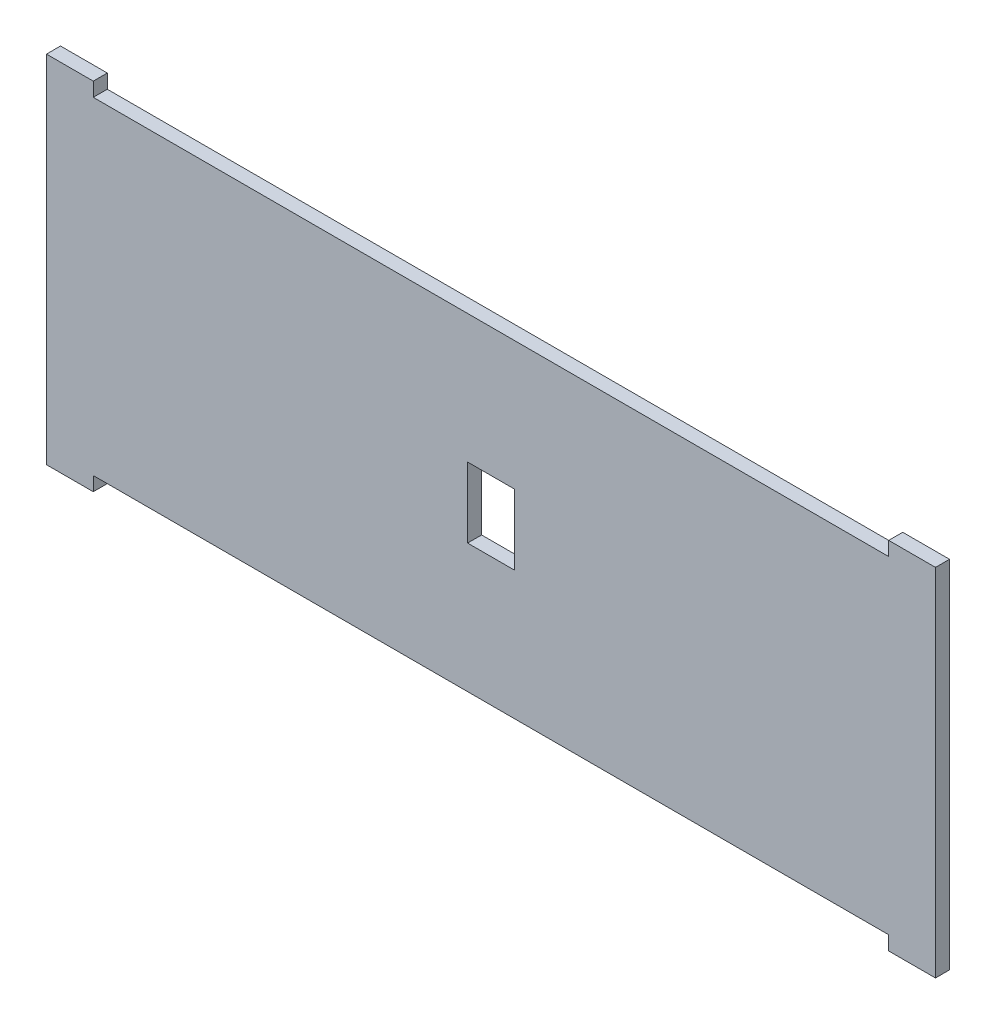
ISO-10303-21;
HEADER;
FILE_DESCRIPTION(('STEP AP214'),'2;1');
FILE_NAME('part.step','',(''),(''),'','','');
FILE_SCHEMA(('AUTOMOTIVE_DESIGN { 1 0 10303 214 1 1 1 1 }'));
ENDSEC;
DATA;
#1=APPLICATION_CONTEXT('core data for automotive mechanical design processes');
#2=APPLICATION_PROTOCOL_DEFINITION('international standard','automotive_design',2000,#1);
#3=PRODUCT_CONTEXT('',#1,'mechanical');
#4=PRODUCT('Part','Part','',(#3));
#5=PRODUCT_RELATED_PRODUCT_CATEGORY('part','',(#4));
#6=PRODUCT_DEFINITION_FORMATION('','',#4);
#7=PRODUCT_DEFINITION_CONTEXT('part definition',#1,'design');
#8=PRODUCT_DEFINITION('design','',#6,#7);
#9=PRODUCT_DEFINITION_SHAPE('','',#8);
#10=(LENGTH_UNIT() NAMED_UNIT(*) SI_UNIT(.MILLI.,.METRE.));
#11=(NAMED_UNIT(*) PLANE_ANGLE_UNIT() SI_UNIT($,.RADIAN.));
#12=(NAMED_UNIT(*) SI_UNIT($,.STERADIAN.) SOLID_ANGLE_UNIT());
#13=UNCERTAINTY_MEASURE_WITH_UNIT(LENGTH_MEASURE(1.E-05),#10,'distance_accuracy_value','');
#14=(GEOMETRIC_REPRESENTATION_CONTEXT(3) GLOBAL_UNCERTAINTY_ASSIGNED_CONTEXT((#13)) GLOBAL_UNIT_ASSIGNED_CONTEXT((#10,
#11,#12)) REPRESENTATION_CONTEXT('',''));
#15=CARTESIAN_POINT('',(0.,0.,0.));
#16=DIRECTION('',(0.,0.,1.));
#17=DIRECTION('',(1.,0.,0.));
#18=AXIS2_PLACEMENT_3D('',#15,#16,#17);
#19=CARTESIAN_POINT('',(-85.0000000000001,0.,3.));
#20=DIRECTION('',(1.,0.,0.));
#21=DIRECTION('',(0.,0.,-1.));
#22=AXIS2_PLACEMENT_3D('',#19,#20,#21);
#23=PLANE('',#22);
#24=DIRECTION('',(0.,-1.,0.));
#25=VECTOR('',#24,1.);
#26=CARTESIAN_POINT('',(-85.0000000000001,0.,0.));
#27=LINE('',#26,#25);
#28=CARTESIAN_POINT('',(-85.0000000000001,-35.,0.));
#29=VERTEX_POINT('',#28);
#30=CARTESIAN_POINT('',(-85.0000000000001,-38.,0.));
#31=VERTEX_POINT('',#30);
#32=EDGE_CURVE('E186',#29,#31,#27,.T.);
#33=ORIENTED_EDGE('',*,*,#32,.F.);
#34=DIRECTION('',(0.,0.,-1.));
#35=VECTOR('',#34,1.);
#36=CARTESIAN_POINT('',(-85.0000000000001,-35.,3.));
#37=LINE('',#36,#35);
#38=CARTESIAN_POINT('',(-85.0000000000001,-35.,3.));
#39=VERTEX_POINT('',#38);
#40=EDGE_CURVE('E312',#39,#29,#37,.T.);
#41=ORIENTED_EDGE('',*,*,#40,.F.);
#42=DIRECTION('',(0.,-1.,0.));
#43=VECTOR('',#42,1.);
#44=CARTESIAN_POINT('',(-85.0000000000001,0.,3.));
#45=LINE('',#44,#43);
#46=CARTESIAN_POINT('',(-85.0000000000001,-38.,3.));
#47=VERTEX_POINT('',#46);
#48=EDGE_CURVE('E191',#39,#47,#45,.T.);
#49=ORIENTED_EDGE('',*,*,#48,.T.);
#50=DIRECTION('',(0.,0.,-1.));
#51=VECTOR('',#50,1.);
#52=CARTESIAN_POINT('',(-85.0000000000001,-38.,3.));
#53=LINE('',#52,#51);
#54=EDGE_CURVE('E233',#47,#31,#53,.T.);
#55=ORIENTED_EDGE('',*,*,#54,.T.);
#56=EDGE_LOOP('',(#33,#41,#49,#55));
#57=FACE_BOUND('',#56,.T.);
#58=ADVANCED_FACE('F42',(#57),#23,.T.);
#59=CARTESIAN_POINT('',(0.,-35.,3.));
#60=DIRECTION('',(0.,-1.,0.));
#61=DIRECTION('',(1.,0.,0.));
#62=AXIS2_PLACEMENT_3D('',#59,#60,#61);
#63=PLANE('',#62);
#64=DIRECTION('',(-1.,0.,0.));
#65=VECTOR('',#64,1.);
#66=CARTESIAN_POINT('',(0.,-35.,0.));
#67=LINE('',#66,#65);
#68=CARTESIAN_POINT('',(85.,-35.,0.));
#69=VERTEX_POINT('',#68);
#70=EDGE_CURVE('E237',#69,#29,#67,.T.);
#71=ORIENTED_EDGE('',*,*,#70,.F.);
#72=DIRECTION('',(0.,0.,-1.));
#73=VECTOR('',#72,1.);
#74=CARTESIAN_POINT('',(85.,-35.,3.));
#75=LINE('',#74,#73);
#76=CARTESIAN_POINT('',(85.,-35.,3.));
#77=VERTEX_POINT('',#76);
#78=EDGE_CURVE('E309',#77,#69,#75,.T.);
#79=ORIENTED_EDGE('',*,*,#78,.F.);
#80=DIRECTION('',(-1.,0.,0.));
#81=VECTOR('',#80,1.);
#82=CARTESIAN_POINT('',(0.,-35.,3.));
#83=LINE('',#82,#81);
#84=EDGE_CURVE('E195',#77,#39,#83,.T.);
#85=ORIENTED_EDGE('',*,*,#84,.T.);
#86=ORIENTED_EDGE('',*,*,#40,.T.);
#87=EDGE_LOOP('',(#71,#79,#85,#86));
#88=FACE_BOUND('',#87,.T.);
#89=ADVANCED_FACE('F340',(#88),#63,.T.);
#90=CARTESIAN_POINT('',(85.,0.,3.));
#91=DIRECTION('',(1.,0.,0.));
#92=DIRECTION('',(0.,0.,-1.));
#93=AXIS2_PLACEMENT_3D('',#90,#91,#92);
#94=PLANE('',#93);
#95=DIRECTION('',(0.,-1.,0.));
#96=VECTOR('',#95,1.);
#97=CARTESIAN_POINT('',(85.,0.,0.));
#98=LINE('',#97,#96);
#99=CARTESIAN_POINT('',(85.,-38.,0.));
#100=VERTEX_POINT('',#99);
#101=EDGE_CURVE('E241',#69,#100,#98,.T.);
#102=ORIENTED_EDGE('',*,*,#101,.T.);
#103=DIRECTION('',(0.,0.,-1.));
#104=VECTOR('',#103,1.);
#105=CARTESIAN_POINT('',(85.,-38.,3.));
#106=LINE('',#105,#104);
#107=CARTESIAN_POINT('',(85.,-38.,3.));
#108=VERTEX_POINT('',#107);
#109=EDGE_CURVE('E306',#108,#100,#106,.T.);
#110=ORIENTED_EDGE('',*,*,#109,.F.);
#111=DIRECTION('',(0.,-1.,0.));
#112=VECTOR('',#111,1.);
#113=CARTESIAN_POINT('',(85.,0.,3.));
#114=LINE('',#113,#112);
#115=EDGE_CURVE('E200',#77,#108,#114,.T.);
#116=ORIENTED_EDGE('',*,*,#115,.F.);
#117=ORIENTED_EDGE('',*,*,#78,.T.);
#118=EDGE_LOOP('',(#102,#110,#116,#117));
#119=FACE_BOUND('',#118,.T.);
#120=ADVANCED_FACE('F345',(#119),#94,.F.);
#121=CARTESIAN_POINT('',(0.,-38.0000000000001,3.));
#122=DIRECTION('',(0.,-1.,0.));
#123=DIRECTION('',(1.,0.,0.));
#124=AXIS2_PLACEMENT_3D('',#121,#122,#123);
#125=PLANE('',#124);
#126=DIRECTION('',(-1.,0.,0.));
#127=VECTOR('',#126,1.);
#128=CARTESIAN_POINT('',(0.,-38.0000000000001,0.));
#129=LINE('',#128,#127);
#130=CARTESIAN_POINT('',(94.9999999999999,-38.,0.));
#131=VERTEX_POINT('',#130);
#132=EDGE_CURVE('E245',#131,#100,#129,.T.);
#133=ORIENTED_EDGE('',*,*,#132,.F.);
#134=DIRECTION('',(0.,0.,-1.));
#135=VECTOR('',#134,1.);
#136=CARTESIAN_POINT('',(94.9999999999999,-38.,3.));
#137=LINE('',#136,#135);
#138=CARTESIAN_POINT('',(94.9999999999999,-38.,3.));
#139=VERTEX_POINT('',#138);
#140=EDGE_CURVE('E303',#139,#131,#137,.T.);
#141=ORIENTED_EDGE('',*,*,#140,.F.);
#142=DIRECTION('',(-1.,0.,0.));
#143=VECTOR('',#142,1.);
#144=CARTESIAN_POINT('',(0.,-38.0000000000001,3.));
#145=LINE('',#144,#143);
#146=EDGE_CURVE('E203',#139,#108,#145,.T.);
#147=ORIENTED_EDGE('',*,*,#146,.T.);
#148=ORIENTED_EDGE('',*,*,#109,.T.);
#149=EDGE_LOOP('',(#133,#141,#147,#148));
#150=FACE_BOUND('',#149,.T.);
#151=ADVANCED_FACE('F391',(#150),#125,.T.);
#152=CARTESIAN_POINT('',(94.9999999999999,0.,3.));
#153=DIRECTION('',(-1.,0.,0.));
#154=DIRECTION('',(0.,0.,1.));
#155=AXIS2_PLACEMENT_3D('',#152,#153,#154);
#156=PLANE('',#155);
#157=DIRECTION('',(0.,1.,0.));
#158=VECTOR('',#157,1.);
#159=CARTESIAN_POINT('',(94.9999999999999,0.,0.));
#160=LINE('',#159,#158);
#161=CARTESIAN_POINT('',(94.9999999999999,38.,0.));
#162=VERTEX_POINT('',#161);
#163=EDGE_CURVE('E249',#131,#162,#160,.T.);
#164=ORIENTED_EDGE('',*,*,#163,.T.);
#165=DIRECTION('',(0.,0.,-1.));
#166=VECTOR('',#165,1.);
#167=CARTESIAN_POINT('',(94.9999999999999,38.,3.));
#168=LINE('',#167,#166);
#169=CARTESIAN_POINT('',(94.9999999999999,38.,3.));
#170=VERTEX_POINT('',#169);
#171=EDGE_CURVE('E299',#170,#162,#168,.T.);
#172=ORIENTED_EDGE('',*,*,#171,.F.);
#173=DIRECTION('',(0.,1.,0.));
#174=VECTOR('',#173,1.);
#175=CARTESIAN_POINT('',(94.9999999999999,0.,3.));
#176=LINE('',#175,#174);
#177=EDGE_CURVE('E207',#139,#170,#176,.T.);
#178=ORIENTED_EDGE('',*,*,#177,.F.);
#179=ORIENTED_EDGE('',*,*,#140,.T.);
#180=EDGE_LOOP('',(#164,#172,#178,#179));
#181=FACE_BOUND('',#180,.T.);
#182=ADVANCED_FACE('F399',(#181),#156,.F.);
#183=CARTESIAN_POINT('',(0.,38.,3.));
#184=DIRECTION('',(0.,-1.,0.));
#185=DIRECTION('',(0.,0.,-1.));
#186=AXIS2_PLACEMENT_3D('',#183,#184,#185);
#187=PLANE('',#186);
#188=DIRECTION('',(-1.,0.,0.));
#189=VECTOR('',#188,1.);
#190=CARTESIAN_POINT('',(0.,38.,0.));
#191=LINE('',#190,#189);
#192=CARTESIAN_POINT('',(85.,38.,0.));
#193=VERTEX_POINT('',#192);
#194=EDGE_CURVE('E252',#162,#193,#191,.T.);
#195=ORIENTED_EDGE('',*,*,#194,.T.);
#196=DIRECTION('',(0.,0.,-1.));
#197=VECTOR('',#196,1.);
#198=CARTESIAN_POINT('',(85.,38.,3.));
#199=LINE('',#198,#197);
#200=CARTESIAN_POINT('',(85.,38.,3.));
#201=VERTEX_POINT('',#200);
#202=EDGE_CURVE('E296',#201,#193,#199,.T.);
#203=ORIENTED_EDGE('',*,*,#202,.F.);
#204=DIRECTION('',(-1.,0.,0.));
#205=VECTOR('',#204,1.);
#206=CARTESIAN_POINT('',(0.,38.,3.));
#207=LINE('',#206,#205);
#208=EDGE_CURVE('E210',#170,#201,#207,.T.);
#209=ORIENTED_EDGE('',*,*,#208,.F.);
#210=ORIENTED_EDGE('',*,*,#171,.T.);
#211=EDGE_LOOP('',(#195,#203,#209,#210));
#212=FACE_BOUND('',#211,.T.);
#213=ADVANCED_FACE('F385',(#212),#187,.F.);
#214=CARTESIAN_POINT('',(85.,0.,3.));
#215=DIRECTION('',(-1.,0.,0.));
#216=DIRECTION('',(0.,0.,1.));
#217=AXIS2_PLACEMENT_3D('',#214,#215,#216);
#218=PLANE('',#217);
#219=DIRECTION('',(0.,1.,0.));
#220=VECTOR('',#219,1.);
#221=CARTESIAN_POINT('',(85.,0.,0.));
#222=LINE('',#221,#220);
#223=CARTESIAN_POINT('',(85.,35.,0.));
#224=VERTEX_POINT('',#223);
#225=EDGE_CURVE('E256',#224,#193,#222,.T.);
#226=ORIENTED_EDGE('',*,*,#225,.F.);
#227=DIRECTION('',(0.,0.,-1.));
#228=VECTOR('',#227,1.);
#229=CARTESIAN_POINT('',(85.,35.,3.));
#230=LINE('',#229,#228);
#231=CARTESIAN_POINT('',(85.,35.,3.));
#232=VERTEX_POINT('',#231);
#233=EDGE_CURVE('E293',#232,#224,#230,.T.);
#234=ORIENTED_EDGE('',*,*,#233,.F.);
#235=DIRECTION('',(0.,1.,0.));
#236=VECTOR('',#235,1.);
#237=CARTESIAN_POINT('',(85.,0.,3.));
#238=LINE('',#237,#236);
#239=EDGE_CURVE('E213',#232,#201,#238,.T.);
#240=ORIENTED_EDGE('',*,*,#239,.T.);
#241=ORIENTED_EDGE('',*,*,#202,.T.);
#242=EDGE_LOOP('',(#226,#234,#240,#241));
#243=FACE_BOUND('',#242,.T.);
#244=ADVANCED_FACE('F379',(#243),#218,.T.);
#245=CARTESIAN_POINT('',(0.,35.,3.));
#246=DIRECTION('',(0.,-1.,0.));
#247=DIRECTION('',(1.,0.,0.));
#248=AXIS2_PLACEMENT_3D('',#245,#246,#247);
#249=PLANE('',#248);
#250=DIRECTION('',(-1.,0.,0.));
#251=VECTOR('',#250,1.);
#252=CARTESIAN_POINT('',(0.,35.,0.));
#253=LINE('',#252,#251);
#254=CARTESIAN_POINT('',(-85.0000000000001,35.,0.));
#255=VERTEX_POINT('',#254);
#256=EDGE_CURVE('E260',#224,#255,#253,.T.);
#257=ORIENTED_EDGE('',*,*,#256,.T.);
#258=DIRECTION('',(0.,0.,-1.));
#259=VECTOR('',#258,1.);
#260=CARTESIAN_POINT('',(-85.0000000000001,35.,3.));
#261=LINE('',#260,#259);
#262=CARTESIAN_POINT('',(-85.0000000000001,35.,3.));
#263=VERTEX_POINT('',#262);
#264=EDGE_CURVE('E289',#263,#255,#261,.T.);
#265=ORIENTED_EDGE('',*,*,#264,.F.);
#266=DIRECTION('',(-1.,0.,0.));
#267=VECTOR('',#266,1.);
#268=CARTESIAN_POINT('',(0.,35.,3.));
#269=LINE('',#268,#267);
#270=EDGE_CURVE('E217',#232,#263,#269,.T.);
#271=ORIENTED_EDGE('',*,*,#270,.F.);
#272=ORIENTED_EDGE('',*,*,#233,.T.);
#273=EDGE_LOOP('',(#257,#265,#271,#272));
#274=FACE_BOUND('',#273,.T.);
#275=ADVANCED_FACE('F408',(#274),#249,.F.);
#276=CARTESIAN_POINT('',(-85.0000000000001,0.,3.));
#277=DIRECTION('',(-1.,0.,0.));
#278=DIRECTION('',(0.,0.,1.));
#279=AXIS2_PLACEMENT_3D('',#276,#277,#278);
#280=PLANE('',#279);
#281=DIRECTION('',(0.,1.,0.));
#282=VECTOR('',#281,1.);
#283=CARTESIAN_POINT('',(-85.0000000000001,0.,0.));
#284=LINE('',#283,#282);
#285=CARTESIAN_POINT('',(-85.0000000000001,38.,0.));
#286=VERTEX_POINT('',#285);
#287=EDGE_CURVE('E263',#255,#286,#284,.T.);
#288=ORIENTED_EDGE('',*,*,#287,.T.);
#289=DIRECTION('',(0.,0.,-1.));
#290=VECTOR('',#289,1.);
#291=CARTESIAN_POINT('',(-85.0000000000001,38.,3.));
#292=LINE('',#291,#290);
#293=CARTESIAN_POINT('',(-85.0000000000001,38.,3.));
#294=VERTEX_POINT('',#293);
#295=EDGE_CURVE('E286',#294,#286,#292,.T.);
#296=ORIENTED_EDGE('',*,*,#295,.F.);
#297=DIRECTION('',(0.,1.,0.));
#298=VECTOR('',#297,1.);
#299=CARTESIAN_POINT('',(-85.0000000000001,0.,3.));
#300=LINE('',#299,#298);
#301=EDGE_CURVE('E220',#263,#294,#300,.T.);
#302=ORIENTED_EDGE('',*,*,#301,.F.);
#303=ORIENTED_EDGE('',*,*,#264,.T.);
#304=EDGE_LOOP('',(#288,#296,#302,#303));
#305=FACE_BOUND('',#304,.T.);
#306=ADVANCED_FACE('F372',(#305),#280,.F.);
#307=CARTESIAN_POINT('',(0.,38.,3.));
#308=DIRECTION('',(0.,1.,0.));
#309=DIRECTION('',(0.,0.,1.));
#310=AXIS2_PLACEMENT_3D('',#307,#308,#309);
#311=PLANE('',#310);
#312=DIRECTION('',(1.,0.,0.));
#313=VECTOR('',#312,1.);
#314=CARTESIAN_POINT('',(0.,38.,0.));
#315=LINE('',#314,#313);
#316=CARTESIAN_POINT('',(-95.0000000000001,38.,0.));
#317=VERTEX_POINT('',#316);
#318=EDGE_CURVE('E267',#317,#286,#315,.T.);
#319=ORIENTED_EDGE('',*,*,#318,.F.);
#320=DIRECTION('',(0.,0.,-1.));
#321=VECTOR('',#320,1.);
#322=CARTESIAN_POINT('',(-95.0000000000001,38.,3.));
#323=LINE('',#322,#321);
#324=CARTESIAN_POINT('',(-95.0000000000001,38.,3.));
#325=VERTEX_POINT('',#324);
#326=EDGE_CURVE('E283',#325,#317,#323,.T.);
#327=ORIENTED_EDGE('',*,*,#326,.F.);
#328=DIRECTION('',(1.,0.,0.));
#329=VECTOR('',#328,1.);
#330=CARTESIAN_POINT('',(0.,38.,3.));
#331=LINE('',#330,#329);
#332=EDGE_CURVE('E223',#325,#294,#331,.T.);
#333=ORIENTED_EDGE('',*,*,#332,.T.);
#334=ORIENTED_EDGE('',*,*,#295,.T.);
#335=EDGE_LOOP('',(#319,#327,#333,#334));
#336=FACE_BOUND('',#335,.T.);
#337=ADVANCED_FACE('F368',(#336),#311,.T.);
#338=CARTESIAN_POINT('',(-95.0000000000001,0.,3.));
#339=DIRECTION('',(1.,0.,0.));
#340=DIRECTION('',(0.,0.,-1.));
#341=AXIS2_PLACEMENT_3D('',#338,#339,#340);
#342=PLANE('',#341);
#343=DIRECTION('',(0.,-1.,0.));
#344=VECTOR('',#343,1.);
#345=CARTESIAN_POINT('',(-95.0000000000001,0.,0.));
#346=LINE('',#345,#344);
#347=CARTESIAN_POINT('',(-95.0000000000001,-38.,0.));
#348=VERTEX_POINT('',#347);
#349=EDGE_CURVE('E271',#317,#348,#346,.T.);
#350=ORIENTED_EDGE('',*,*,#349,.T.);
#351=DIRECTION('',(0.,0.,-1.));
#352=VECTOR('',#351,1.);
#353=CARTESIAN_POINT('',(-95.0000000000001,-38.,3.));
#354=LINE('',#353,#352);
#355=CARTESIAN_POINT('',(-95.0000000000001,-38.,3.));
#356=VERTEX_POINT('',#355);
#357=EDGE_CURVE('E279',#356,#348,#354,.T.);
#358=ORIENTED_EDGE('',*,*,#357,.F.);
#359=DIRECTION('',(0.,-1.,0.));
#360=VECTOR('',#359,1.);
#361=CARTESIAN_POINT('',(-95.0000000000001,0.,3.));
#362=LINE('',#361,#360);
#363=EDGE_CURVE('E227',#325,#356,#362,.T.);
#364=ORIENTED_EDGE('',*,*,#363,.F.);
#365=ORIENTED_EDGE('',*,*,#326,.T.);
#366=EDGE_LOOP('',(#350,#358,#364,#365));
#367=FACE_BOUND('',#366,.T.);
#368=ADVANCED_FACE('F415',(#367),#342,.F.);
#369=CARTESIAN_POINT('',(0.,-38.,3.));
#370=DIRECTION('',(0.,1.,0.));
#371=DIRECTION('',(0.,0.,1.));
#372=AXIS2_PLACEMENT_3D('',#369,#370,#371);
#373=PLANE('',#372);
#374=DIRECTION('',(1.,0.,0.));
#375=VECTOR('',#374,1.);
#376=CARTESIAN_POINT('',(0.,-38.,0.));
#377=LINE('',#376,#375);
#378=EDGE_CURVE('E196',#348,#31,#377,.T.);
#379=ORIENTED_EDGE('',*,*,#378,.T.);
#380=ORIENTED_EDGE('',*,*,#54,.F.);
#381=DIRECTION('',(1.,0.,0.));
#382=VECTOR('',#381,1.);
#383=CARTESIAN_POINT('',(0.,-38.,3.));
#384=LINE('',#383,#382);
#385=EDGE_CURVE('E230',#356,#47,#384,.T.);
#386=ORIENTED_EDGE('',*,*,#385,.F.);
#387=ORIENTED_EDGE('',*,*,#357,.T.);
#388=EDGE_LOOP('',(#379,#380,#386,#387));
#389=FACE_BOUND('',#388,.T.);
#390=ADVANCED_FACE('F362',(#389),#373,.F.);
#391=CARTESIAN_POINT('',(0.,0.,3.));
#392=DIRECTION('',(0.,0.,1.));
#393=DIRECTION('',(1.,0.,0.));
#394=AXIS2_PLACEMENT_3D('',#391,#392,#393);
#395=PLANE('',#394);
#396=DIRECTION('',(0.,-1.,0.));
#397=VECTOR('',#396,1.);
#398=CARTESIAN_POINT('',(-5.,-7.5,3.));
#399=LINE('',#398,#397);
#400=CARTESIAN_POINT('',(-5.,7.5,3.));
#401=VERTEX_POINT('',#400);
#402=CARTESIAN_POINT('',(-5.,-7.5,3.));
#403=VERTEX_POINT('',#402);
#404=EDGE_CURVE('E57',#401,#403,#399,.T.);
#405=ORIENTED_EDGE('',*,*,#404,.F.);
#406=DIRECTION('',(-1.,0.,0.));
#407=VECTOR('',#406,1.);
#408=CARTESIAN_POINT('',(5.,7.5,3.));
#409=LINE('',#408,#407);
#410=CARTESIAN_POINT('',(5.,7.5,3.));
#411=VERTEX_POINT('',#410);
#412=EDGE_CURVE('E176',#411,#401,#409,.T.);
#413=ORIENTED_EDGE('',*,*,#412,.F.);
#414=DIRECTION('',(0.,1.,0.));
#415=VECTOR('',#414,1.);
#416=CARTESIAN_POINT('',(5.,-7.5,3.));
#417=LINE('',#416,#415);
#418=CARTESIAN_POINT('',(5.,-7.5,3.));
#419=VERTEX_POINT('',#418);
#420=EDGE_CURVE('E158',#419,#411,#417,.T.);
#421=ORIENTED_EDGE('',*,*,#420,.F.);
#422=DIRECTION('',(1.,0.,0.));
#423=VECTOR('',#422,1.);
#424=CARTESIAN_POINT('',(5.,-7.5,3.));
#425=LINE('',#424,#423);
#426=EDGE_CURVE('E168',#403,#419,#425,.T.);
#427=ORIENTED_EDGE('',*,*,#426,.F.);
#428=EDGE_LOOP('',(#405,#413,#421,#427));
#429=FACE_BOUND('',#428,.T.);
#430=ORIENTED_EDGE('',*,*,#48,.F.);
#431=ORIENTED_EDGE('',*,*,#84,.F.);
#432=ORIENTED_EDGE('',*,*,#115,.T.);
#433=ORIENTED_EDGE('',*,*,#146,.F.);
#434=ORIENTED_EDGE('',*,*,#177,.T.);
#435=ORIENTED_EDGE('',*,*,#208,.T.);
#436=ORIENTED_EDGE('',*,*,#239,.F.);
#437=ORIENTED_EDGE('',*,*,#270,.T.);
#438=ORIENTED_EDGE('',*,*,#301,.T.);
#439=ORIENTED_EDGE('',*,*,#332,.F.);
#440=ORIENTED_EDGE('',*,*,#363,.T.);
#441=ORIENTED_EDGE('',*,*,#385,.T.);
#442=EDGE_LOOP('',(#430,#431,#432,#433,#434,#435,#436,#437,#438,#439,#440,#441));
#443=FACE_BOUND('',#442,.T.);
#444=ADVANCED_FACE('F173',(#429,#443),#395,.T.);
#445=CARTESIAN_POINT('',(0.,0.,0.));
#446=DIRECTION('',(0.,0.,1.));
#447=DIRECTION('',(1.,0.,0.));
#448=AXIS2_PLACEMENT_3D('',#445,#446,#447);
#449=PLANE('',#448);
#450=DIRECTION('',(-1.,0.,0.));
#451=VECTOR('',#450,1.);
#452=CARTESIAN_POINT('',(0.,7.5,0.));
#453=LINE('',#452,#451);
#454=CARTESIAN_POINT('',(5.,7.5,0.));
#455=VERTEX_POINT('',#454);
#456=CARTESIAN_POINT('',(-5.,7.5,0.));
#457=VERTEX_POINT('',#456);
#458=EDGE_CURVE('E50',#455,#457,#453,.T.);
#459=ORIENTED_EDGE('',*,*,#458,.T.);
#460=DIRECTION('',(0.,-1.,0.));
#461=VECTOR('',#460,1.);
#462=CARTESIAN_POINT('',(-5.,0.,0.));
#463=LINE('',#462,#461);
#464=CARTESIAN_POINT('',(-5.,-7.5,0.));
#465=VERTEX_POINT('',#464);
#466=EDGE_CURVE('E11',#457,#465,#463,.T.);
#467=ORIENTED_EDGE('',*,*,#466,.T.);
#468=DIRECTION('',(1.,0.,0.));
#469=VECTOR('',#468,1.);
#470=CARTESIAN_POINT('',(0.,-7.5,0.));
#471=LINE('',#470,#469);
#472=CARTESIAN_POINT('',(5.,-7.5,0.));
#473=VERTEX_POINT('',#472);
#474=EDGE_CURVE('E315',#465,#473,#471,.T.);
#475=ORIENTED_EDGE('',*,*,#474,.T.);
#476=DIRECTION('',(0.,1.,0.));
#477=VECTOR('',#476,1.);
#478=CARTESIAN_POINT('',(5.,0.,0.));
#479=LINE('',#478,#477);
#480=EDGE_CURVE('E161',#473,#455,#479,.T.);
#481=ORIENTED_EDGE('',*,*,#480,.T.);
#482=EDGE_LOOP('',(#459,#467,#475,#481));
#483=FACE_BOUND('',#482,.T.);
#484=ORIENTED_EDGE('',*,*,#32,.T.);
#485=ORIENTED_EDGE('',*,*,#378,.F.);
#486=ORIENTED_EDGE('',*,*,#349,.F.);
#487=ORIENTED_EDGE('',*,*,#318,.T.);
#488=ORIENTED_EDGE('',*,*,#287,.F.);
#489=ORIENTED_EDGE('',*,*,#256,.F.);
#490=ORIENTED_EDGE('',*,*,#225,.T.);
#491=ORIENTED_EDGE('',*,*,#194,.F.);
#492=ORIENTED_EDGE('',*,*,#163,.F.);
#493=ORIENTED_EDGE('',*,*,#132,.T.);
#494=ORIENTED_EDGE('',*,*,#101,.F.);
#495=ORIENTED_EDGE('',*,*,#70,.T.);
#496=EDGE_LOOP('',(#484,#485,#486,#487,#488,#489,#490,#491,#492,#493,#494,#495));
#497=FACE_BOUND('',#496,.T.);
#498=ADVANCED_FACE('F322',(#483,#497),#449,.F.);
#499=CARTESIAN_POINT('',(-5.,-7.5,-7.));
#500=DIRECTION('',(-1.,0.,0.));
#501=DIRECTION('',(0.,0.,1.));
#502=AXIS2_PLACEMENT_3D('',#499,#500,#501);
#503=PLANE('',#502);
#504=DIRECTION('',(0.,0.,1.));
#505=VECTOR('',#504,1.);
#506=CARTESIAN_POINT('',(-5.,7.5,-7.));
#507=LINE('',#506,#505);
#508=EDGE_CURVE('E183',#457,#401,#507,.T.);
#509=ORIENTED_EDGE('',*,*,#508,.T.);
#510=ORIENTED_EDGE('',*,*,#404,.T.);
#511=DIRECTION('',(0.,0.,1.));
#512=VECTOR('',#511,1.);
#513=CARTESIAN_POINT('',(-5.,-7.5,-7.));
#514=LINE('',#513,#512);
#515=EDGE_CURVE('E165',#465,#403,#514,.T.);
#516=ORIENTED_EDGE('',*,*,#515,.F.);
#517=ORIENTED_EDGE('',*,*,#466,.F.);
#518=EDGE_LOOP('',(#509,#510,#516,#517));
#519=FACE_BOUND('',#518,.T.);
#520=ADVANCED_FACE('F327',(#519),#503,.F.);
#521=CARTESIAN_POINT('',(5.,7.5,-7.));
#522=DIRECTION('',(0.,1.,0.));
#523=DIRECTION('',(-1.,0.,0.));
#524=AXIS2_PLACEMENT_3D('',#521,#522,#523);
#525=PLANE('',#524);
#526=DIRECTION('',(0.,0.,1.));
#527=VECTOR('',#526,1.);
#528=CARTESIAN_POINT('',(5.,7.5,-7.));
#529=LINE('',#528,#527);
#530=EDGE_CURVE('E164',#455,#411,#529,.T.);
#531=ORIENTED_EDGE('',*,*,#530,.T.);
#532=ORIENTED_EDGE('',*,*,#412,.T.);
#533=ORIENTED_EDGE('',*,*,#508,.F.);
#534=ORIENTED_EDGE('',*,*,#458,.F.);
#535=EDGE_LOOP('',(#531,#532,#533,#534));
#536=FACE_BOUND('',#535,.T.);
#537=ADVANCED_FACE('F326',(#536),#525,.F.);
#538=CARTESIAN_POINT('',(5.,-7.5,-7.));
#539=DIRECTION('',(1.,0.,0.));
#540=DIRECTION('',(0.,0.,-1.));
#541=AXIS2_PLACEMENT_3D('',#538,#539,#540);
#542=PLANE('',#541);
#543=DIRECTION('',(0.,0.,1.));
#544=VECTOR('',#543,1.);
#545=CARTESIAN_POINT('',(5.,-7.5,-7.));
#546=LINE('',#545,#544);
#547=EDGE_CURVE('E65',#473,#419,#546,.T.);
#548=ORIENTED_EDGE('',*,*,#547,.T.);
#549=ORIENTED_EDGE('',*,*,#420,.T.);
#550=ORIENTED_EDGE('',*,*,#530,.F.);
#551=ORIENTED_EDGE('',*,*,#480,.F.);
#552=EDGE_LOOP('',(#548,#549,#550,#551));
#553=FACE_BOUND('',#552,.T.);
#554=ADVANCED_FACE('F155',(#553),#542,.F.);
#555=CARTESIAN_POINT('',(5.,-7.5,-7.));
#556=DIRECTION('',(0.,-1.,0.));
#557=DIRECTION('',(1.,0.,0.));
#558=AXIS2_PLACEMENT_3D('',#555,#556,#557);
#559=PLANE('',#558);
#560=ORIENTED_EDGE('',*,*,#515,.T.);
#561=ORIENTED_EDGE('',*,*,#426,.T.);
#562=ORIENTED_EDGE('',*,*,#547,.F.);
#563=ORIENTED_EDGE('',*,*,#474,.F.);
#564=EDGE_LOOP('',(#560,#561,#562,#563));
#565=FACE_BOUND('',#564,.T.);
#566=ADVANCED_FACE('F169',(#565),#559,.F.);
#567=CLOSED_SHELL('',(#58,#89,#120,#151,#182,#213,#244,#275,#306,#337,#368,#390,#444,#498,#520,
#537,#554,#566));
#568=MANIFOLD_SOLID_BREP('B2',#567);
#569=ADVANCED_BREP_SHAPE_REPRESENTATION('',(#18,#568),#14);
#570=SHAPE_DEFINITION_REPRESENTATION(#9,#569);
ENDSEC;
END-ISO-10303-21;
